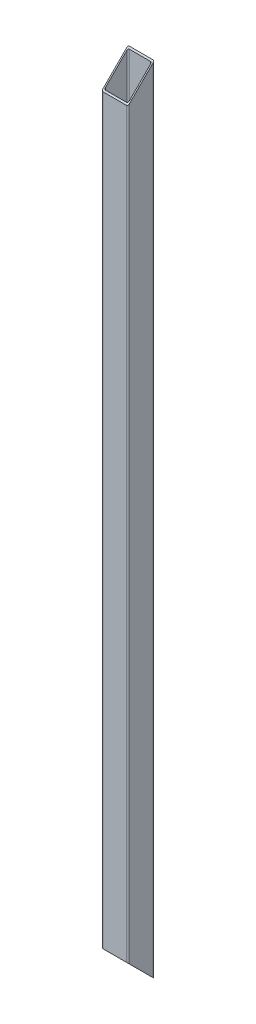
ISO-10303-21;
HEADER;
FILE_DESCRIPTION(('STEP AP214'),'2;1');
FILE_NAME('part.step','',(''),(''),'','','');
FILE_SCHEMA(('AUTOMOTIVE_DESIGN { 1 0 10303 214 1 1 1 1 }'));
ENDSEC;
DATA;
#1=APPLICATION_CONTEXT('core data for automotive mechanical design processes');
#2=APPLICATION_PROTOCOL_DEFINITION('international standard','automotive_design',2000,#1);
#3=PRODUCT_CONTEXT('',#1,'mechanical');
#4=PRODUCT('Part','Part','',(#3));
#5=PRODUCT_RELATED_PRODUCT_CATEGORY('part','',(#4));
#6=PRODUCT_DEFINITION_FORMATION('','',#4);
#7=PRODUCT_DEFINITION_CONTEXT('part definition',#1,'design');
#8=PRODUCT_DEFINITION('design','',#6,#7);
#9=PRODUCT_DEFINITION_SHAPE('','',#8);
#10=(LENGTH_UNIT() NAMED_UNIT(*) SI_UNIT(.MILLI.,.METRE.));
#11=(NAMED_UNIT(*) PLANE_ANGLE_UNIT() SI_UNIT($,.RADIAN.));
#12=(NAMED_UNIT(*) SI_UNIT($,.STERADIAN.) SOLID_ANGLE_UNIT());
#13=UNCERTAINTY_MEASURE_WITH_UNIT(LENGTH_MEASURE(1.E-05),#10,'distance_accuracy_value','');
#14=(GEOMETRIC_REPRESENTATION_CONTEXT(3) GLOBAL_UNCERTAINTY_ASSIGNED_CONTEXT((#13)) GLOBAL_UNIT_ASSIGNED_CONTEXT((#10,
#11,#12)) REPRESENTATION_CONTEXT('',''));
#15=CARTESIAN_POINT('',(0.,0.,0.));
#16=DIRECTION('',(0.,0.,1.));
#17=DIRECTION('',(1.,0.,0.));
#18=AXIS2_PLACEMENT_3D('',#15,#16,#17);
#19=CARTESIAN_POINT('',(3.,1810.,0.));
#20=DIRECTION('',(-1.,0.,0.));
#21=DIRECTION('',(0.,0.,1.));
#22=AXIS2_PLACEMENT_3D('',#19,#20,#21);
#23=PLANE('',#22);
#24=DIRECTION('',(0.,0.707106781186549,0.707106781186546));
#25=VECTOR('',#24,1.);
#26=CARTESIAN_POINT('',(3.,935.000000000003,875.));
#27=LINE('',#26,#25);
#28=CARTESIAN_POINT('',(3.,6.00000000000023,-54.));
#29=VERTEX_POINT('',#28);
#30=CARTESIAN_POINT('',(3.,54.0000000000003,-6.00000000000002));
#31=VERTEX_POINT('',#30);
#32=EDGE_CURVE('E49',#29,#31,#27,.T.);
#33=ORIENTED_EDGE('',*,*,#32,.F.);
#34=DIRECTION('',(0.,-1.,0.));
#35=VECTOR('',#34,1.);
#36=CARTESIAN_POINT('',(3.,1810.,-54.));
#37=LINE('',#36,#35);
#38=CARTESIAN_POINT('',(3.,1804.,-54.));
#39=VERTEX_POINT('',#38);
#40=EDGE_CURVE('E11',#39,#29,#37,.T.);
#41=ORIENTED_EDGE('',*,*,#40,.F.);
#42=DIRECTION('',(0.,-0.707106781186549,0.707106781186546));
#43=VECTOR('',#42,1.);
#44=CARTESIAN_POINT('',(3.,1780.,-30.));
#45=LINE('',#44,#43);
#46=CARTESIAN_POINT('',(3.,1756.,-6.00000000000002));
#47=VERTEX_POINT('',#46);
#48=EDGE_CURVE('E158',#39,#47,#45,.T.);
#49=ORIENTED_EDGE('',*,*,#48,.T.);
#50=DIRECTION('',(0.,-1.,0.));
#51=VECTOR('',#50,1.);
#52=CARTESIAN_POINT('',(3.,1810.,-6.00000000000002));
#53=LINE('',#52,#51);
#54=EDGE_CURVE('E192',#47,#31,#53,.T.);
#55=ORIENTED_EDGE('',*,*,#54,.T.);
#56=EDGE_LOOP('',(#33,#41,#49,#55));
#57=FACE_BOUND('',#56,.T.);
#58=ADVANCED_FACE('F32',(#57),#23,.F.);
#59=CARTESIAN_POINT('',(6.,1810.,-54.));
#60=DIRECTION('',(0.,-1.,0.));
#61=DIRECTION('',(0.,0.,-1.));
#62=AXIS2_PLACEMENT_3D('',#59,#60,#61);
#63=CYLINDRICAL_SURFACE('',#62,3.);
#64=CARTESIAN_POINT('',(6.,6.00000000000023,-54.));
#65=DIRECTION('',(0.,-0.707106781186546,0.707106781186549));
#66=DIRECTION('',(0.,-0.707106781186549,-0.707106781186546));
#67=AXIS2_PLACEMENT_3D('',#64,#65,#66);
#68=ELLIPSE('',#67,4.24264068711929,3.);
#69=CARTESIAN_POINT('',(6.00000000000002,3.00000000000011,-57.));
#70=VERTEX_POINT('',#69);
#71=EDGE_CURVE('E234',#70,#29,#68,.F.);
#72=ORIENTED_EDGE('',*,*,#71,.F.);
#73=DIRECTION('',(0.,-1.,0.));
#74=VECTOR('',#73,1.);
#75=CARTESIAN_POINT('',(6.00000000000002,1810.,-57.));
#76=LINE('',#75,#74);
#77=CARTESIAN_POINT('',(6.00000000000002,1807.,-57.));
#78=VERTEX_POINT('',#77);
#79=EDGE_CURVE('E41',#78,#70,#76,.T.);
#80=ORIENTED_EDGE('',*,*,#79,.F.);
#81=CARTESIAN_POINT('',(6.,1804.,-54.));
#82=DIRECTION('',(0.,-0.707106781186546,-0.707106781186549));
#83=DIRECTION('',(0.,-0.707106781186549,0.707106781186546));
#84=AXIS2_PLACEMENT_3D('',#81,#82,#83);
#85=ELLIPSE('',#84,4.24264068711929,3.);
#86=EDGE_CURVE('E232',#78,#39,#85,.F.);
#87=ORIENTED_EDGE('',*,*,#86,.T.);
#88=ORIENTED_EDGE('',*,*,#40,.T.);
#89=EDGE_LOOP('',(#72,#80,#87,#88));
#90=FACE_BOUND('',#89,.T.);
#91=ADVANCED_FACE('F231',(#90),#63,.F.);
#92=CARTESIAN_POINT('',(0.,1810.,-57.));
#93=DIRECTION('',(0.,0.,-1.));
#94=DIRECTION('',(-1.,0.,0.));
#95=AXIS2_PLACEMENT_3D('',#92,#93,#94);
#96=PLANE('',#95);
#97=DIRECTION('',(-1.,0.,0.));
#98=VECTOR('',#97,1.);
#99=CARTESIAN_POINT('',(0.,3.00000000000011,-57.));
#100=LINE('',#99,#98);
#101=CARTESIAN_POINT('',(54.,3.00000000000011,-57.));
#102=VERTEX_POINT('',#101);
#103=EDGE_CURVE('E226',#102,#70,#100,.T.);
#104=ORIENTED_EDGE('',*,*,#103,.F.);
#105=DIRECTION('',(0.,-1.,0.));
#106=VECTOR('',#105,1.);
#107=CARTESIAN_POINT('',(54.,1810.,-57.));
#108=LINE('',#107,#106);
#109=CARTESIAN_POINT('',(54.,1807.,-57.));
#110=VERTEX_POINT('',#109);
#111=EDGE_CURVE('E216',#110,#102,#108,.T.);
#112=ORIENTED_EDGE('',*,*,#111,.F.);
#113=DIRECTION('',(-1.,0.,0.));
#114=VECTOR('',#113,1.);
#115=CARTESIAN_POINT('',(0.,1807.,-57.));
#116=LINE('',#115,#114);
#117=EDGE_CURVE('E227',#110,#78,#116,.T.);
#118=ORIENTED_EDGE('',*,*,#117,.T.);
#119=ORIENTED_EDGE('',*,*,#79,.T.);
#120=EDGE_LOOP('',(#104,#112,#118,#119));
#121=FACE_BOUND('',#120,.T.);
#122=ADVANCED_FACE('F224',(#121),#96,.F.);
#123=CARTESIAN_POINT('',(54.,1810.,-54.));
#124=DIRECTION('',(0.,-1.,0.));
#125=DIRECTION('',(0.,0.,-1.));
#126=AXIS2_PLACEMENT_3D('',#123,#124,#125);
#127=CYLINDRICAL_SURFACE('',#126,3.);
#128=CARTESIAN_POINT('',(54.,6.00000000000023,-54.));
#129=DIRECTION('',(0.,-0.707106781186546,0.707106781186549));
#130=DIRECTION('',(0.,-0.707106781186549,-0.707106781186546));
#131=AXIS2_PLACEMENT_3D('',#128,#129,#130);
#132=ELLIPSE('',#131,4.2426406871193,3.);
#133=CARTESIAN_POINT('',(57.,6.00000000000023,-53.9999999999999));
#134=VERTEX_POINT('',#133);
#135=EDGE_CURVE('E238',#134,#102,#132,.F.);
#136=ORIENTED_EDGE('',*,*,#135,.F.);
#137=DIRECTION('',(0.,-1.,0.));
#138=VECTOR('',#137,1.);
#139=CARTESIAN_POINT('',(57.,1810.,-54.));
#140=LINE('',#139,#138);
#141=CARTESIAN_POINT('',(57.,1804.,-54.));
#142=VERTEX_POINT('',#141);
#143=EDGE_CURVE('E213',#142,#134,#140,.T.);
#144=ORIENTED_EDGE('',*,*,#143,.F.);
#145=CARTESIAN_POINT('',(54.,1804.,-54.));
#146=DIRECTION('',(0.,-0.707106781186546,-0.707106781186549));
#147=DIRECTION('',(0.,-0.707106781186549,0.707106781186546));
#148=AXIS2_PLACEMENT_3D('',#145,#146,#147);
#149=ELLIPSE('',#148,4.2426406871193,3.);
#150=EDGE_CURVE('E266',#142,#110,#149,.F.);
#151=ORIENTED_EDGE('',*,*,#150,.T.);
#152=ORIENTED_EDGE('',*,*,#111,.T.);
#153=EDGE_LOOP('',(#136,#144,#151,#152));
#154=FACE_BOUND('',#153,.T.);
#155=ADVANCED_FACE('F290',(#154),#127,.F.);
#156=CARTESIAN_POINT('',(57.,1810.,0.));
#157=DIRECTION('',(-1.,0.,0.));
#158=DIRECTION('',(0.,0.,1.));
#159=AXIS2_PLACEMENT_3D('',#156,#157,#158);
#160=PLANE('',#159);
#161=ORIENTED_EDGE('',*,*,#143,.T.);
#162=DIRECTION('',(0.,0.707106781186549,0.707106781186546));
#163=VECTOR('',#162,1.);
#164=CARTESIAN_POINT('',(57.,935.000000000003,875.));
#165=LINE('',#164,#163);
#166=CARTESIAN_POINT('',(57.,54.0000000000003,-6.00000000000002));
#167=VERTEX_POINT('',#166);
#168=EDGE_CURVE('E285',#134,#167,#165,.T.);
#169=ORIENTED_EDGE('',*,*,#168,.T.);
#170=DIRECTION('',(0.,-1.,0.));
#171=VECTOR('',#170,1.);
#172=CARTESIAN_POINT('',(57.,1810.,-6.00000000000002));
#173=LINE('',#172,#171);
#174=CARTESIAN_POINT('',(57.,1756.,-6.00000000000002));
#175=VERTEX_POINT('',#174);
#176=EDGE_CURVE('E210',#175,#167,#173,.T.);
#177=ORIENTED_EDGE('',*,*,#176,.F.);
#178=DIRECTION('',(0.,-0.707106781186549,0.707106781186546));
#179=VECTOR('',#178,1.);
#180=CARTESIAN_POINT('',(57.,1780.,-30.));
#181=LINE('',#180,#179);
#182=EDGE_CURVE('E264',#142,#175,#181,.T.);
#183=ORIENTED_EDGE('',*,*,#182,.F.);
#184=EDGE_LOOP('',(#161,#169,#177,#183));
#185=FACE_BOUND('',#184,.T.);
#186=ADVANCED_FACE('F293',(#185),#160,.T.);
#187=CARTESIAN_POINT('',(54.,1810.,-6.));
#188=DIRECTION('',(0.,-1.,0.));
#189=DIRECTION('',(0.,0.,-1.));
#190=AXIS2_PLACEMENT_3D('',#187,#188,#189);
#191=CYLINDRICAL_SURFACE('',#190,3.);
#192=CARTESIAN_POINT('',(54.,54.0000000000003,-6.));
#193=DIRECTION('',(0.,-0.707106781186546,0.707106781186549));
#194=DIRECTION('',(0.,-0.707106781186549,-0.707106781186546));
#195=AXIS2_PLACEMENT_3D('',#192,#193,#194);
#196=ELLIPSE('',#195,4.24264068711929,3.);
#197=CARTESIAN_POINT('',(54.,57.0000000000002,-3.));
#198=VERTEX_POINT('',#197);
#199=EDGE_CURVE('E278',#198,#167,#196,.F.);
#200=ORIENTED_EDGE('',*,*,#199,.F.);
#201=DIRECTION('',(0.,-1.,0.));
#202=VECTOR('',#201,1.);
#203=CARTESIAN_POINT('',(54.,1810.,-3.));
#204=LINE('',#203,#202);
#205=CARTESIAN_POINT('',(54.,1753.,-3.));
#206=VERTEX_POINT('',#205);
#207=EDGE_CURVE('E204',#206,#198,#204,.T.);
#208=ORIENTED_EDGE('',*,*,#207,.F.);
#209=CARTESIAN_POINT('',(54.,1756.,-6.));
#210=DIRECTION('',(0.,-0.707106781186546,-0.707106781186549));
#211=DIRECTION('',(0.,-0.707106781186549,0.707106781186546));
#212=AXIS2_PLACEMENT_3D('',#209,#210,#211);
#213=ELLIPSE('',#212,4.24264068711929,3.);
#214=EDGE_CURVE('E261',#206,#175,#213,.F.);
#215=ORIENTED_EDGE('',*,*,#214,.T.);
#216=ORIENTED_EDGE('',*,*,#176,.T.);
#217=EDGE_LOOP('',(#200,#208,#215,#216));
#218=FACE_BOUND('',#217,.T.);
#219=ADVANCED_FACE('F299',(#218),#191,.F.);
#220=CARTESIAN_POINT('',(0.,1810.,-3.));
#221=DIRECTION('',(0.,0.,-1.));
#222=DIRECTION('',(-1.,0.,0.));
#223=AXIS2_PLACEMENT_3D('',#220,#221,#222);
#224=PLANE('',#223);
#225=ORIENTED_EDGE('',*,*,#207,.T.);
#226=DIRECTION('',(-1.,0.,0.));
#227=VECTOR('',#226,1.);
#228=CARTESIAN_POINT('',(0.,57.0000000000002,-3.));
#229=LINE('',#228,#227);
#230=CARTESIAN_POINT('',(6.00000000000002,57.0000000000004,-3.));
#231=VERTEX_POINT('',#230);
#232=EDGE_CURVE('E276',#198,#231,#229,.T.);
#233=ORIENTED_EDGE('',*,*,#232,.T.);
#234=DIRECTION('',(0.,-1.,0.));
#235=VECTOR('',#234,1.);
#236=CARTESIAN_POINT('',(6.00000000000002,1810.,-3.));
#237=LINE('',#236,#235);
#238=CARTESIAN_POINT('',(6.00000000000002,1753.,-3.));
#239=VERTEX_POINT('',#238);
#240=EDGE_CURVE('E198',#239,#231,#237,.T.);
#241=ORIENTED_EDGE('',*,*,#240,.F.);
#242=DIRECTION('',(-1.,0.,0.));
#243=VECTOR('',#242,1.);
#244=CARTESIAN_POINT('',(0.,1753.,-3.));
#245=LINE('',#244,#243);
#246=EDGE_CURVE('E57',#206,#239,#245,.T.);
#247=ORIENTED_EDGE('',*,*,#246,.F.);
#248=EDGE_LOOP('',(#225,#233,#241,#247));
#249=FACE_BOUND('',#248,.T.);
#250=ADVANCED_FACE('F301',(#249),#224,.T.);
#251=CARTESIAN_POINT('',(3.,1810.,-57.));
#252=DIRECTION('',(0.,-1.,0.));
#253=DIRECTION('',(0.,0.,-1.));
#254=AXIS2_PLACEMENT_3D('',#251,#252,#253);
#255=CYLINDRICAL_SURFACE('',#254,3.);
#256=DIRECTION('',(0.,-1.,0.));
#257=VECTOR('',#256,1.);
#258=CARTESIAN_POINT('',(3.00000000000002,1810.,-60.));
#259=LINE('',#258,#257);
#260=CARTESIAN_POINT('',(3.,1810.,-59.9999999999999));
#261=VERTEX_POINT('',#260);
#262=CARTESIAN_POINT('',(3.00000000000002,0.,-60.));
#263=VERTEX_POINT('',#262);
#264=EDGE_CURVE('E172',#261,#263,#259,.T.);
#265=ORIENTED_EDGE('',*,*,#264,.T.);
#266=CARTESIAN_POINT('',(3.,3.00000000000011,-57.));
#267=DIRECTION('',(0.,-0.707106781186546,0.707106781186549));
#268=DIRECTION('',(0.,-0.707106781186549,-0.707106781186546));
#269=AXIS2_PLACEMENT_3D('',#266,#267,#268);
#270=ELLIPSE('',#269,4.24264068711929,3.);
#271=CARTESIAN_POINT('',(0.,3.00000000000011,-56.9999999999999));
#272=VERTEX_POINT('',#271);
#273=EDGE_CURVE('E152',#263,#272,#270,.F.);
#274=ORIENTED_EDGE('',*,*,#273,.T.);
#275=DIRECTION('',(0.,-1.,0.));
#276=VECTOR('',#275,1.);
#277=CARTESIAN_POINT('',(0.,1810.,-57.));
#278=LINE('',#277,#276);
#279=CARTESIAN_POINT('',(0.,1807.,-57.));
#280=VERTEX_POINT('',#279);
#281=EDGE_CURVE('E36',#280,#272,#278,.T.);
#282=ORIENTED_EDGE('',*,*,#281,.F.);
#283=CARTESIAN_POINT('',(3.,1807.,-57.));
#284=DIRECTION('',(0.,-0.707106781186546,-0.707106781186549));
#285=DIRECTION('',(0.,-0.707106781186549,0.707106781186546));
#286=AXIS2_PLACEMENT_3D('',#283,#284,#285);
#287=ELLIPSE('',#286,4.24264068711929,3.);
#288=EDGE_CURVE('E256',#261,#280,#287,.F.);
#289=ORIENTED_EDGE('',*,*,#288,.F.);
#290=EDGE_LOOP('',(#265,#274,#282,#289));
#291=FACE_BOUND('',#290,.T.);
#292=ADVANCED_FACE('F34',(#291),#255,.T.);
#293=CARTESIAN_POINT('',(0.,1810.,0.));
#294=DIRECTION('',(-1.,0.,0.));
#295=DIRECTION('',(0.,0.,1.));
#296=AXIS2_PLACEMENT_3D('',#293,#294,#295);
#297=PLANE('',#296);
#298=ORIENTED_EDGE('',*,*,#281,.T.);
#299=DIRECTION('',(0.,0.707106781186549,0.707106781186546));
#300=VECTOR('',#299,1.);
#301=CARTESIAN_POINT('',(0.,935.000000000003,875.));
#302=LINE('',#301,#300);
#303=CARTESIAN_POINT('',(0.,57.0000000000002,-3.00000000000002));
#304=VERTEX_POINT('',#303);
#305=EDGE_CURVE('E280',#272,#304,#302,.T.);
#306=ORIENTED_EDGE('',*,*,#305,.T.);
#307=DIRECTION('',(0.,-1.,0.));
#308=VECTOR('',#307,1.);
#309=CARTESIAN_POINT('',(0.,1810.,-3.00000000000002));
#310=LINE('',#309,#308);
#311=CARTESIAN_POINT('',(0.,1753.,-3.00000000000002));
#312=VERTEX_POINT('',#311);
#313=EDGE_CURVE('E185',#312,#304,#310,.T.);
#314=ORIENTED_EDGE('',*,*,#313,.F.);
#315=DIRECTION('',(0.,-0.707106781186549,0.707106781186546));
#316=VECTOR('',#315,1.);
#317=CARTESIAN_POINT('',(0.,1780.,-30.));
#318=LINE('',#317,#316);
#319=EDGE_CURVE('E254',#280,#312,#318,.T.);
#320=ORIENTED_EDGE('',*,*,#319,.F.);
#321=EDGE_LOOP('',(#298,#306,#314,#320));
#322=FACE_BOUND('',#321,.T.);
#323=ADVANCED_FACE('F308',(#322),#297,.T.);
#324=CARTESIAN_POINT('',(3.,1810.,-3.));
#325=DIRECTION('',(0.,-1.,0.));
#326=DIRECTION('',(0.,0.,-1.));
#327=AXIS2_PLACEMENT_3D('',#324,#325,#326);
#328=CYLINDRICAL_SURFACE('',#327,3.);
#329=ORIENTED_EDGE('',*,*,#313,.T.);
#330=CARTESIAN_POINT('',(3.,57.0000000000002,-3.));
#331=DIRECTION('',(0.,-0.707106781186546,0.707106781186549));
#332=DIRECTION('',(0.,-0.707106781186549,-0.707106781186546));
#333=AXIS2_PLACEMENT_3D('',#330,#331,#332);
#334=ELLIPSE('',#333,4.24264068711929,3.);
#335=CARTESIAN_POINT('',(3.00000000000002,60.0000000000003,0.));
#336=VERTEX_POINT('',#335);
#337=EDGE_CURVE('E461',#304,#336,#334,.F.);
#338=ORIENTED_EDGE('',*,*,#337,.T.);
#339=DIRECTION('',(0.,-1.,0.));
#340=VECTOR('',#339,1.);
#341=CARTESIAN_POINT('',(3.00000000000002,1810.,0.));
#342=LINE('',#341,#340);
#343=CARTESIAN_POINT('',(3.00000000000002,1750.,0.));
#344=VERTEX_POINT('',#343);
#345=EDGE_CURVE('E183',#344,#336,#342,.T.);
#346=ORIENTED_EDGE('',*,*,#345,.F.);
#347=CARTESIAN_POINT('',(3.,1753.,-3.));
#348=DIRECTION('',(0.,-0.707106781186546,-0.707106781186549));
#349=DIRECTION('',(0.,-0.707106781186549,0.707106781186546));
#350=AXIS2_PLACEMENT_3D('',#347,#348,#349);
#351=ELLIPSE('',#350,4.24264068711929,3.);
#352=EDGE_CURVE('E252',#312,#344,#351,.F.);
#353=ORIENTED_EDGE('',*,*,#352,.F.);
#354=EDGE_LOOP('',(#329,#338,#346,#353));
#355=FACE_BOUND('',#354,.T.);
#356=ADVANCED_FACE('F335',(#355),#328,.T.);
#357=CARTESIAN_POINT('',(0.,1810.,0.));
#358=DIRECTION('',(0.,0.,-1.));
#359=DIRECTION('',(-1.,0.,0.));
#360=AXIS2_PLACEMENT_3D('',#357,#358,#359);
#361=PLANE('',#360);
#362=DIRECTION('',(-1.,0.,0.));
#363=VECTOR('',#362,1.);
#364=CARTESIAN_POINT('',(0.,60.0000000000003,0.));
#365=LINE('',#364,#363);
#366=CARTESIAN_POINT('',(57.,60.0000000000003,0.));
#367=VERTEX_POINT('',#366);
#368=EDGE_CURVE('E462',#367,#336,#365,.T.);
#369=ORIENTED_EDGE('',*,*,#368,.F.);
#370=DIRECTION('',(0.,-1.,0.));
#371=VECTOR('',#370,1.);
#372=CARTESIAN_POINT('',(57.,1810.,0.));
#373=LINE('',#372,#371);
#374=CARTESIAN_POINT('',(57.,1750.,0.));
#375=VERTEX_POINT('',#374);
#376=EDGE_CURVE('E180',#375,#367,#373,.T.);
#377=ORIENTED_EDGE('',*,*,#376,.F.);
#378=DIRECTION('',(-1.,0.,0.));
#379=VECTOR('',#378,1.);
#380=CARTESIAN_POINT('',(0.,1750.,0.));
#381=LINE('',#380,#379);
#382=EDGE_CURVE('E249',#375,#344,#381,.T.);
#383=ORIENTED_EDGE('',*,*,#382,.T.);
#384=ORIENTED_EDGE('',*,*,#345,.T.);
#385=EDGE_LOOP('',(#369,#377,#383,#384));
#386=FACE_BOUND('',#385,.T.);
#387=ADVANCED_FACE('F331',(#386),#361,.F.);
#388=CARTESIAN_POINT('',(57.,1810.,-3.));
#389=DIRECTION('',(0.,-1.,0.));
#390=DIRECTION('',(0.,0.,-1.));
#391=AXIS2_PLACEMENT_3D('',#388,#389,#390);
#392=CYLINDRICAL_SURFACE('',#391,3.);
#393=CARTESIAN_POINT('',(57.,57.0000000000002,-3.));
#394=DIRECTION('',(0.,-0.707106781186546,0.707106781186549));
#395=DIRECTION('',(0.,-0.707106781186549,-0.707106781186546));
#396=AXIS2_PLACEMENT_3D('',#393,#394,#395);
#397=ELLIPSE('',#396,4.24264068711929,3.);
#398=CARTESIAN_POINT('',(60.,57.0000000000003,-3.));
#399=VERTEX_POINT('',#398);
#400=EDGE_CURVE('E466',#399,#367,#397,.T.);
#401=ORIENTED_EDGE('',*,*,#400,.F.);
#402=DIRECTION('',(0.,-1.,0.));
#403=VECTOR('',#402,1.);
#404=CARTESIAN_POINT('',(60.,1810.,-3.00000000000002));
#405=LINE('',#404,#403);
#406=CARTESIAN_POINT('',(60.,1753.,-3.00000000000002));
#407=VERTEX_POINT('',#406);
#408=EDGE_CURVE('E174',#407,#399,#405,.T.);
#409=ORIENTED_EDGE('',*,*,#408,.F.);
#410=CARTESIAN_POINT('',(57.,1753.,-3.));
#411=DIRECTION('',(0.,-0.707106781186546,-0.707106781186549));
#412=DIRECTION('',(0.,-0.707106781186549,0.707106781186546));
#413=AXIS2_PLACEMENT_3D('',#410,#411,#412);
#414=ELLIPSE('',#413,4.24264068711929,3.);
#415=EDGE_CURVE('E246',#407,#375,#414,.T.);
#416=ORIENTED_EDGE('',*,*,#415,.T.);
#417=ORIENTED_EDGE('',*,*,#376,.T.);
#418=EDGE_LOOP('',(#401,#409,#416,#417));
#419=FACE_BOUND('',#418,.T.);
#420=ADVANCED_FACE('F327',(#419),#392,.T.);
#421=CARTESIAN_POINT('',(60.,1810.,0.));
#422=DIRECTION('',(-1.,0.,0.));
#423=DIRECTION('',(0.,0.,1.));
#424=AXIS2_PLACEMENT_3D('',#421,#422,#423);
#425=PLANE('',#424);
#426=DIRECTION('',(0.,0.707106781186549,0.707106781186546));
#427=VECTOR('',#426,1.);
#428=CARTESIAN_POINT('',(60.,935.000000000003,875.));
#429=LINE('',#428,#427);
#430=CARTESIAN_POINT('',(60.,3.00000000000011,-57.));
#431=VERTEX_POINT('',#430);
#432=EDGE_CURVE('E169',#431,#399,#429,.T.);
#433=ORIENTED_EDGE('',*,*,#432,.F.);
#434=DIRECTION('',(0.,-1.,0.));
#435=VECTOR('',#434,1.);
#436=CARTESIAN_POINT('',(60.,1810.,-57.));
#437=LINE('',#436,#435);
#438=CARTESIAN_POINT('',(60.,1807.,-57.));
#439=VERTEX_POINT('',#438);
#440=EDGE_CURVE('E168',#439,#431,#437,.T.);
#441=ORIENTED_EDGE('',*,*,#440,.F.);
#442=DIRECTION('',(0.,-0.707106781186549,0.707106781186546));
#443=VECTOR('',#442,1.);
#444=CARTESIAN_POINT('',(60.,1780.,-30.));
#445=LINE('',#444,#443);
#446=EDGE_CURVE('E243',#439,#407,#445,.T.);
#447=ORIENTED_EDGE('',*,*,#446,.T.);
#448=ORIENTED_EDGE('',*,*,#408,.T.);
#449=EDGE_LOOP('',(#433,#441,#447,#448));
#450=FACE_BOUND('',#449,.T.);
#451=ADVANCED_FACE('F324',(#450),#425,.F.);
#452=CARTESIAN_POINT('',(57.,1810.,-57.));
#453=DIRECTION('',(0.,-1.,0.));
#454=DIRECTION('',(0.,0.,-1.));
#455=AXIS2_PLACEMENT_3D('',#452,#453,#454);
#456=CYLINDRICAL_SURFACE('',#455,3.);
#457=ORIENTED_EDGE('',*,*,#440,.T.);
#458=CARTESIAN_POINT('',(57.,3.00000000000011,-57.));
#459=DIRECTION('',(0.,-0.707106781186546,0.707106781186549));
#460=DIRECTION('',(0.,-0.707106781186549,-0.707106781186546));
#461=AXIS2_PLACEMENT_3D('',#458,#459,#460);
#462=ELLIPSE('',#461,4.2426406871193,3.);
#463=CARTESIAN_POINT('',(57.,0.,-60.));
#464=VERTEX_POINT('',#463);
#465=EDGE_CURVE('E149',#431,#464,#462,.F.);
#466=ORIENTED_EDGE('',*,*,#465,.T.);
#467=DIRECTION('',(0.,-1.,0.));
#468=VECTOR('',#467,1.);
#469=CARTESIAN_POINT('',(57.,1810.,-60.));
#470=LINE('',#469,#468);
#471=CARTESIAN_POINT('',(57.,1810.,-60.));
#472=VERTEX_POINT('',#471);
#473=EDGE_CURVE('E165',#472,#464,#470,.T.);
#474=ORIENTED_EDGE('',*,*,#473,.F.);
#475=CARTESIAN_POINT('',(57.,1807.,-57.));
#476=DIRECTION('',(0.,-0.707106781186546,-0.707106781186549));
#477=DIRECTION('',(0.,-0.707106781186549,0.707106781186546));
#478=AXIS2_PLACEMENT_3D('',#475,#476,#477);
#479=ELLIPSE('',#478,4.2426406871193,3.);
#480=EDGE_CURVE('E236',#439,#472,#479,.F.);
#481=ORIENTED_EDGE('',*,*,#480,.F.);
#482=EDGE_LOOP('',(#457,#466,#474,#481));
#483=FACE_BOUND('',#482,.T.);
#484=ADVANCED_FACE('F163',(#483),#456,.T.);
#485=CARTESIAN_POINT('',(6.,1810.,-6.));
#486=DIRECTION('',(0.,-1.,0.));
#487=DIRECTION('',(0.,0.,-1.));
#488=AXIS2_PLACEMENT_3D('',#485,#486,#487);
#489=CYLINDRICAL_SURFACE('',#488,3.);
#490=ORIENTED_EDGE('',*,*,#240,.T.);
#491=CARTESIAN_POINT('',(6.,54.0000000000003,-6.));
#492=DIRECTION('',(0.,-0.707106781186546,0.707106781186549));
#493=DIRECTION('',(0.,-0.707106781186549,-0.707106781186546));
#494=AXIS2_PLACEMENT_3D('',#491,#492,#493);
#495=ELLIPSE('',#494,4.24264068711929,3.);
#496=EDGE_CURVE('E274',#231,#31,#495,.T.);
#497=ORIENTED_EDGE('',*,*,#496,.T.);
#498=ORIENTED_EDGE('',*,*,#54,.F.);
#499=CARTESIAN_POINT('',(6.,1756.,-6.));
#500=DIRECTION('',(0.,-0.707106781186546,-0.707106781186549));
#501=DIRECTION('',(0.,-0.707106781186549,0.707106781186546));
#502=AXIS2_PLACEMENT_3D('',#499,#500,#501);
#503=ELLIPSE('',#502,4.24264068711929,3.);
#504=EDGE_CURVE('E258',#239,#47,#503,.T.);
#505=ORIENTED_EDGE('',*,*,#504,.F.);
#506=EDGE_LOOP('',(#490,#497,#498,#505));
#507=FACE_BOUND('',#506,.T.);
#508=ADVANCED_FACE('F272',(#507),#489,.F.);
#509=CARTESIAN_POINT('',(0.,1810.,-60.));
#510=DIRECTION('',(0.,0.,-1.));
#511=DIRECTION('',(-1.,0.,0.));
#512=AXIS2_PLACEMENT_3D('',#509,#510,#511);
#513=PLANE('',#512);
#514=DIRECTION('',(1.,0.,0.));
#515=VECTOR('',#514,1.);
#516=CARTESIAN_POINT('',(0.,0.,-60.));
#517=LINE('',#516,#515);
#518=EDGE_CURVE('E146',#263,#464,#517,.T.);
#519=ORIENTED_EDGE('',*,*,#518,.F.);
#520=ORIENTED_EDGE('',*,*,#264,.F.);
#521=DIRECTION('',(1.,0.,0.));
#522=VECTOR('',#521,1.);
#523=CARTESIAN_POINT('',(0.,1810.,-60.));
#524=LINE('',#523,#522);
#525=EDGE_CURVE('E157',#261,#472,#524,.T.);
#526=ORIENTED_EDGE('',*,*,#525,.T.);
#527=ORIENTED_EDGE('',*,*,#473,.T.);
#528=EDGE_LOOP('',(#519,#520,#526,#527));
#529=FACE_BOUND('',#528,.T.);
#530=ADVANCED_FACE('F171',(#529),#513,.T.);
#531=CARTESIAN_POINT('',(0.,874.999999999997,875.));
#532=DIRECTION('',(0.,-0.707106781186546,-0.707106781186549));
#533=DIRECTION('',(0.,0.707106781186549,-0.707106781186546));
#534=AXIS2_PLACEMENT_3D('',#531,#532,#533);
#535=PLANE('',#534);
#536=ORIENTED_EDGE('',*,*,#288,.T.);
#537=ORIENTED_EDGE('',*,*,#319,.T.);
#538=ORIENTED_EDGE('',*,*,#352,.T.);
#539=ORIENTED_EDGE('',*,*,#382,.F.);
#540=ORIENTED_EDGE('',*,*,#415,.F.);
#541=ORIENTED_EDGE('',*,*,#446,.F.);
#542=ORIENTED_EDGE('',*,*,#480,.T.);
#543=ORIENTED_EDGE('',*,*,#525,.F.);
#544=EDGE_LOOP('',(#536,#537,#538,#539,#540,#541,#542,#543));
#545=FACE_BOUND('',#544,.T.);
#546=ORIENTED_EDGE('',*,*,#86,.F.);
#547=ORIENTED_EDGE('',*,*,#117,.F.);
#548=ORIENTED_EDGE('',*,*,#150,.F.);
#549=ORIENTED_EDGE('',*,*,#182,.T.);
#550=ORIENTED_EDGE('',*,*,#214,.F.);
#551=ORIENTED_EDGE('',*,*,#246,.T.);
#552=ORIENTED_EDGE('',*,*,#504,.T.);
#553=ORIENTED_EDGE('',*,*,#48,.F.);
#554=EDGE_LOOP('',(#546,#547,#548,#549,#550,#551,#552,#553));
#555=FACE_BOUND('',#554,.T.);
#556=ADVANCED_FACE('F295',(#545,#555),#535,.F.);
#557=CARTESIAN_POINT('',(0.,30.,-30.0000000000001));
#558=DIRECTION('',(0.,-0.707106781186546,0.707106781186549));
#559=DIRECTION('',(0.,-0.707106781186549,-0.707106781186546));
#560=AXIS2_PLACEMENT_3D('',#557,#558,#559);
#561=PLANE('',#560);
#562=ORIENTED_EDGE('',*,*,#518,.T.);
#563=ORIENTED_EDGE('',*,*,#465,.F.);
#564=ORIENTED_EDGE('',*,*,#432,.T.);
#565=ORIENTED_EDGE('',*,*,#400,.T.);
#566=ORIENTED_EDGE('',*,*,#368,.T.);
#567=ORIENTED_EDGE('',*,*,#337,.F.);
#568=ORIENTED_EDGE('',*,*,#305,.F.);
#569=ORIENTED_EDGE('',*,*,#273,.F.);
#570=EDGE_LOOP('',(#562,#563,#564,#565,#566,#567,#568,#569));
#571=FACE_BOUND('',#570,.T.);
#572=ORIENTED_EDGE('',*,*,#32,.T.);
#573=ORIENTED_EDGE('',*,*,#496,.F.);
#574=ORIENTED_EDGE('',*,*,#232,.F.);
#575=ORIENTED_EDGE('',*,*,#199,.T.);
#576=ORIENTED_EDGE('',*,*,#168,.F.);
#577=ORIENTED_EDGE('',*,*,#135,.T.);
#578=ORIENTED_EDGE('',*,*,#103,.T.);
#579=ORIENTED_EDGE('',*,*,#71,.T.);
#580=EDGE_LOOP('',(#572,#573,#574,#575,#576,#577,#578,#579));
#581=FACE_BOUND('',#580,.T.);
#582=ADVANCED_FACE('F148',(#571,#581),#561,.T.);
#583=CLOSED_SHELL('',(#58,#91,#122,#155,#186,#219,#250,#292,#323,#356,#387,#420,#451,#484,#508,
#530,#556,#582));
#584=MANIFOLD_SOLID_BREP('B2',#583);
#585=ADVANCED_BREP_SHAPE_REPRESENTATION('',(#18,#584),#14);
#586=SHAPE_DEFINITION_REPRESENTATION(#9,#585);
ENDSEC;
END-ISO-10303-21;
